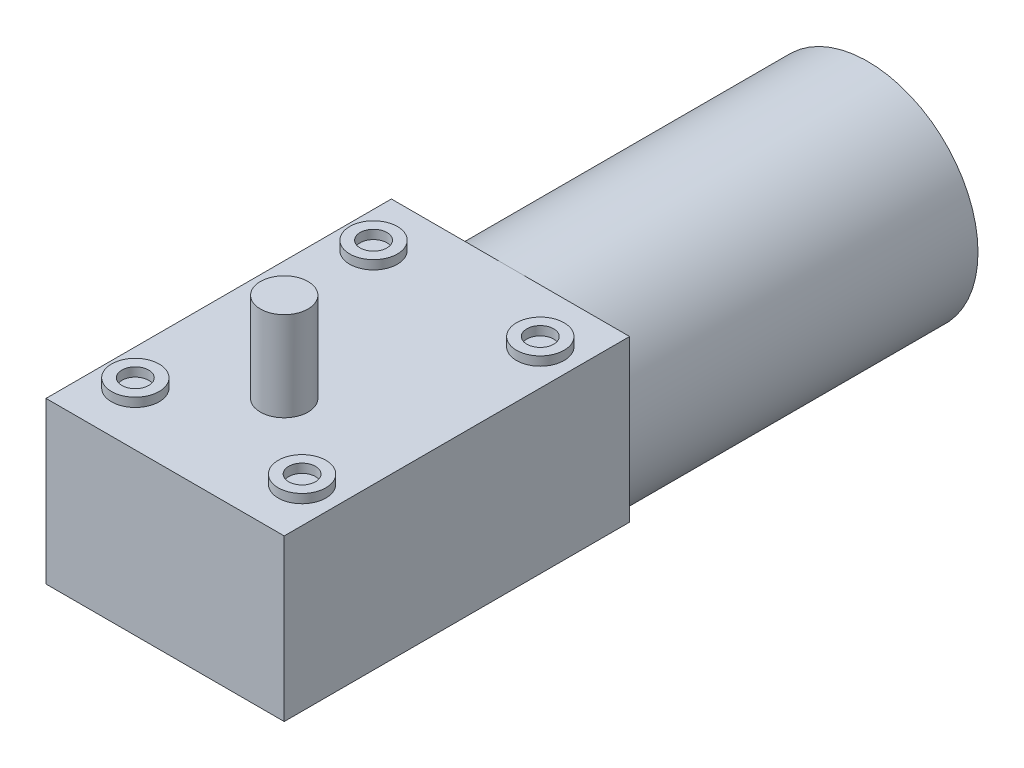
ISO-10303-21;
HEADER;
FILE_DESCRIPTION(('STEP AP214'),'2;1');
FILE_NAME('part.step','',(''),(''),'','','');
FILE_SCHEMA(('AUTOMOTIVE_DESIGN { 1 0 10303 214 1 1 1 1 }'));
ENDSEC;
DATA;
#1=APPLICATION_CONTEXT('core data for automotive mechanical design processes');
#2=APPLICATION_PROTOCOL_DEFINITION('international standard','automotive_design',2000,#1);
#3=PRODUCT_CONTEXT('',#1,'mechanical');
#4=PRODUCT('Part','Part','',(#3));
#5=PRODUCT_RELATED_PRODUCT_CATEGORY('part','',(#4));
#6=PRODUCT_DEFINITION_FORMATION('','',#4);
#7=PRODUCT_DEFINITION_CONTEXT('part definition',#1,'design');
#8=PRODUCT_DEFINITION('design','',#6,#7);
#9=PRODUCT_DEFINITION_SHAPE('','',#8);
#10=(LENGTH_UNIT() NAMED_UNIT(*) SI_UNIT(.MILLI.,.METRE.));
#11=(NAMED_UNIT(*) PLANE_ANGLE_UNIT() SI_UNIT($,.RADIAN.));
#12=(NAMED_UNIT(*) SI_UNIT($,.STERADIAN.) SOLID_ANGLE_UNIT());
#13=UNCERTAINTY_MEASURE_WITH_UNIT(LENGTH_MEASURE(1.E-05),#10,'distance_accuracy_value','');
#14=(GEOMETRIC_REPRESENTATION_CONTEXT(3) GLOBAL_UNCERTAINTY_ASSIGNED_CONTEXT((#13)) GLOBAL_UNIT_ASSIGNED_CONTEXT((#10,
#11,#12)) REPRESENTATION_CONTEXT('',''));
#15=CARTESIAN_POINT('',(0.,0.,0.));
#16=DIRECTION('',(0.,0.,1.));
#17=DIRECTION('',(1.,0.,0.));
#18=AXIS2_PLACEMENT_3D('',#15,#16,#17);
#19=CARTESIAN_POINT('',(0.,0.,60.));
#20=DIRECTION('',(0.,0.,-1.));
#21=DIRECTION('',(-1.,0.,0.));
#22=AXIS2_PLACEMENT_3D('',#19,#20,#21);
#23=CYLINDRICAL_SURFACE('',#22,18.5);
#24=CARTESIAN_POINT('',(0.,0.,60.));
#25=DIRECTION('',(0.,0.,1.));
#26=DIRECTION('',(1.,0.,0.));
#27=AXIS2_PLACEMENT_3D('',#24,#25,#26);
#28=CIRCLE('',#27,18.5);
#29=CARTESIAN_POINT('',(0.,18.5,60.));
#30=VERTEX_POINT('',#29);
#31=CARTESIAN_POINT('',(-16.431676725155,-8.5,60.));
#32=VERTEX_POINT('',#31);
#33=EDGE_CURVE('E109',#30,#32,#28,.T.);
#34=ORIENTED_EDGE('',*,*,#33,.F.);
#35=CARTESIAN_POINT('',(16.431676725155,-8.5,60.));
#36=VERTEX_POINT('',#35);
#37=EDGE_CURVE('E63',#36,#30,#28,.T.);
#38=ORIENTED_EDGE('',*,*,#37,.F.);
#39=EDGE_CURVE('E135',#32,#36,#28,.T.);
#40=ORIENTED_EDGE('',*,*,#39,.F.);
#41=EDGE_LOOP('',(#34,#38,#40));
#42=FACE_BOUND('',#41,.T.);
#43=CARTESIAN_POINT('',(0.,0.,0.));
#44=DIRECTION('',(0.,0.,1.));
#45=DIRECTION('',(1.,0.,0.));
#46=AXIS2_PLACEMENT_3D('',#43,#44,#45);
#47=CIRCLE('',#46,18.5);
#48=CARTESIAN_POINT('',(18.5,0.,0.));
#49=VERTEX_POINT('',#48);
#50=EDGE_CURVE('E132',#49,#49,#47,.T.);
#51=ORIENTED_EDGE('',*,*,#50,.T.);
#52=EDGE_LOOP('',(#51));
#53=FACE_BOUND('',#52,.T.);
#54=ADVANCED_FACE('F41',(#42,#53),#23,.T.);
#55=CARTESIAN_POINT('',(0.,0.,0.));
#56=DIRECTION('',(0.,0.,1.));
#57=DIRECTION('',(1.,0.,0.));
#58=AXIS2_PLACEMENT_3D('',#55,#56,#57);
#59=PLANE('',#58);
#60=ORIENTED_EDGE('',*,*,#50,.F.);
#61=EDGE_LOOP('',(#60));
#62=FACE_BOUND('',#61,.T.);
#63=ADVANCED_FACE('F234',(#62),#59,.F.);
#64=CARTESIAN_POINT('',(0.,0.,60.));
#65=DIRECTION('',(0.,0.,1.));
#66=DIRECTION('',(1.,0.,0.));
#67=AXIS2_PLACEMENT_3D('',#64,#65,#66);
#68=PLANE('',#67);
#69=ORIENTED_EDGE('',*,*,#33,.T.);
#70=DIRECTION('',(1.,0.,0.));
#71=VECTOR('',#70,1.);
#72=CARTESIAN_POINT('',(20.,-8.5,60.));
#73=LINE('',#72,#71);
#74=CARTESIAN_POINT('',(-20.,-8.5,60.));
#75=VERTEX_POINT('',#74);
#76=EDGE_CURVE('E95',#75,#32,#73,.T.);
#77=ORIENTED_EDGE('',*,*,#76,.F.);
#78=DIRECTION('',(0.,-1.,0.));
#79=VECTOR('',#78,1.);
#80=CARTESIAN_POINT('',(-20.,18.5,60.));
#81=LINE('',#80,#79);
#82=CARTESIAN_POINT('',(-20.,18.5,60.));
#83=VERTEX_POINT('',#82);
#84=EDGE_CURVE('E108',#83,#75,#81,.T.);
#85=ORIENTED_EDGE('',*,*,#84,.F.);
#86=DIRECTION('',(-1.,0.,0.));
#87=VECTOR('',#86,1.);
#88=CARTESIAN_POINT('',(-20.,18.5,60.));
#89=LINE('',#88,#87);
#90=EDGE_CURVE('E123',#30,#83,#89,.T.);
#91=ORIENTED_EDGE('',*,*,#90,.F.);
#92=EDGE_LOOP('',(#69,#77,#85,#91));
#93=FACE_BOUND('',#92,.T.);
#94=ADVANCED_FACE('F106',(#93),#68,.F.);
#95=DIRECTION('',(0.,1.,0.));
#96=VECTOR('',#95,1.);
#97=CARTESIAN_POINT('',(20.,18.5,60.));
#98=LINE('',#97,#96);
#99=CARTESIAN_POINT('',(20.,-8.5,60.));
#100=VERTEX_POINT('',#99);
#101=CARTESIAN_POINT('',(20.,18.5,60.));
#102=VERTEX_POINT('',#101);
#103=EDGE_CURVE('E169',#100,#102,#98,.T.);
#104=ORIENTED_EDGE('',*,*,#103,.F.);
#105=EDGE_CURVE('E102',#36,#100,#73,.T.);
#106=ORIENTED_EDGE('',*,*,#105,.F.);
#107=ORIENTED_EDGE('',*,*,#37,.T.);
#108=EDGE_CURVE('E118',#102,#30,#89,.T.);
#109=ORIENTED_EDGE('',*,*,#108,.F.);
#110=EDGE_LOOP('',(#104,#106,#107,#109));
#111=FACE_BOUND('',#110,.T.);
#112=ADVANCED_FACE('F168',(#111),#68,.F.);
#113=CARTESIAN_POINT('',(20.,18.5,118.));
#114=DIRECTION('',(-1.,0.,0.));
#115=DIRECTION('',(0.,0.,1.));
#116=AXIS2_PLACEMENT_3D('',#113,#114,#115);
#117=PLANE('',#116);
#118=DIRECTION('',(0.,1.,0.));
#119=VECTOR('',#118,1.);
#120=CARTESIAN_POINT('',(20.,18.5,118.));
#121=LINE('',#120,#119);
#122=CARTESIAN_POINT('',(20.,-8.5,118.));
#123=VERTEX_POINT('',#122);
#124=CARTESIAN_POINT('',(20.,18.5,118.));
#125=VERTEX_POINT('',#124);
#126=EDGE_CURVE('E117',#123,#125,#121,.T.);
#127=ORIENTED_EDGE('',*,*,#126,.F.);
#128=DIRECTION('',(0.,0.,1.));
#129=VECTOR('',#128,1.);
#130=CARTESIAN_POINT('',(20.,-8.5,18.7689437438234));
#131=LINE('',#130,#129);
#132=EDGE_CURVE('E55',#100,#123,#131,.T.);
#133=ORIENTED_EDGE('',*,*,#132,.F.);
#134=ORIENTED_EDGE('',*,*,#103,.T.);
#135=DIRECTION('',(0.,0.,-1.));
#136=VECTOR('',#135,1.);
#137=CARTESIAN_POINT('',(20.,18.5,118.));
#138=LINE('',#137,#136);
#139=EDGE_CURVE('E128',#125,#102,#138,.T.);
#140=ORIENTED_EDGE('',*,*,#139,.F.);
#141=EDGE_LOOP('',(#127,#133,#134,#140));
#142=FACE_BOUND('',#141,.T.);
#143=ADVANCED_FACE('F154',(#142),#117,.F.);
#144=CARTESIAN_POINT('',(-20.,18.5,118.));
#145=DIRECTION('',(0.,-1.,0.));
#146=DIRECTION('',(0.,0.,-1.));
#147=AXIS2_PLACEMENT_3D('',#144,#145,#146);
#148=PLANE('',#147);
#149=CARTESIAN_POINT('',(-14.,18.5,69.));
#150=DIRECTION('',(0.,-1.,0.));
#151=DIRECTION('',(0.,0.,-1.));
#152=AXIS2_PLACEMENT_3D('',#149,#150,#151);
#153=CIRCLE('',#152,4.);
#154=CARTESIAN_POINT('',(-14.,18.5,65.));
#155=VERTEX_POINT('',#154);
#156=EDGE_CURVE('E11',#155,#155,#153,.F.);
#157=ORIENTED_EDGE('',*,*,#156,.F.);
#158=EDGE_LOOP('',(#157));
#159=FACE_BOUND('',#158,.T.);
#160=CARTESIAN_POINT('',(-14.,18.5,109.));
#161=DIRECTION('',(0.,-1.,0.));
#162=DIRECTION('',(0.,0.,-1.));
#163=AXIS2_PLACEMENT_3D('',#160,#161,#162);
#164=CIRCLE('',#163,4.);
#165=CARTESIAN_POINT('',(-14.,18.5,105.));
#166=VERTEX_POINT('',#165);
#167=EDGE_CURVE('E48',#166,#166,#164,.F.);
#168=ORIENTED_EDGE('',*,*,#167,.F.);
#169=EDGE_LOOP('',(#168));
#170=FACE_BOUND('',#169,.T.);
#171=CARTESIAN_POINT('',(14.,18.5,109.));
#172=DIRECTION('',(0.,-1.,0.));
#173=DIRECTION('',(0.,0.,-1.));
#174=AXIS2_PLACEMENT_3D('',#171,#172,#173);
#175=CIRCLE('',#174,4.);
#176=CARTESIAN_POINT('',(14.,18.5,105.));
#177=VERTEX_POINT('',#176);
#178=EDGE_CURVE('E144',#177,#177,#175,.F.);
#179=ORIENTED_EDGE('',*,*,#178,.F.);
#180=EDGE_LOOP('',(#179));
#181=FACE_BOUND('',#180,.T.);
#182=CARTESIAN_POINT('',(14.,18.5,69.));
#183=DIRECTION('',(0.,-1.,0.));
#184=DIRECTION('',(0.,0.,-1.));
#185=AXIS2_PLACEMENT_3D('',#182,#183,#184);
#186=CIRCLE('',#185,4.);
#187=CARTESIAN_POINT('',(14.,18.5,65.));
#188=VERTEX_POINT('',#187);
#189=EDGE_CURVE('E141',#188,#188,#186,.F.);
#190=ORIENTED_EDGE('',*,*,#189,.F.);
#191=EDGE_LOOP('',(#190));
#192=FACE_BOUND('',#191,.T.);
#193=CARTESIAN_POINT('',(0.,18.5,98.));
#194=DIRECTION('',(0.,-1.,0.));
#195=DIRECTION('',(0.,0.,-1.));
#196=AXIS2_PLACEMENT_3D('',#193,#194,#195);
#197=CIRCLE('',#196,4.);
#198=CARTESIAN_POINT('',(0.,18.5,94.));
#199=VERTEX_POINT('',#198);
#200=EDGE_CURVE('E134',#199,#199,#197,.F.);
#201=ORIENTED_EDGE('',*,*,#200,.F.);
#202=EDGE_LOOP('',(#201));
#203=FACE_BOUND('',#202,.T.);
#204=ORIENTED_EDGE('',*,*,#108,.T.);
#205=ORIENTED_EDGE('',*,*,#90,.T.);
#206=DIRECTION('',(0.,0.,-1.));
#207=VECTOR('',#206,1.);
#208=CARTESIAN_POINT('',(-20.,18.5,118.));
#209=LINE('',#208,#207);
#210=CARTESIAN_POINT('',(-20.,18.5,118.));
#211=VERTEX_POINT('',#210);
#212=EDGE_CURVE('E116',#211,#83,#209,.T.);
#213=ORIENTED_EDGE('',*,*,#212,.F.);
#214=DIRECTION('',(-1.,0.,0.));
#215=VECTOR('',#214,1.);
#216=CARTESIAN_POINT('',(-20.,18.5,118.));
#217=LINE('',#216,#215);
#218=EDGE_CURVE('E120',#125,#211,#217,.T.);
#219=ORIENTED_EDGE('',*,*,#218,.F.);
#220=ORIENTED_EDGE('',*,*,#139,.T.);
#221=EDGE_LOOP('',(#204,#205,#213,#219,#220));
#222=FACE_BOUND('',#221,.T.);
#223=ADVANCED_FACE('F151',(#159,#170,#181,#192,#203,#222),#148,.F.);
#224=CARTESIAN_POINT('',(-20.,18.5,118.));
#225=DIRECTION('',(1.,0.,0.));
#226=DIRECTION('',(0.,1.,0.));
#227=AXIS2_PLACEMENT_3D('',#224,#225,#226);
#228=PLANE('',#227);
#229=ORIENTED_EDGE('',*,*,#84,.T.);
#230=DIRECTION('',(0.,0.,1.));
#231=VECTOR('',#230,1.);
#232=CARTESIAN_POINT('',(-20.,-8.5,18.7689437438234));
#233=LINE('',#232,#231);
#234=CARTESIAN_POINT('',(-20.,-8.5,118.));
#235=VERTEX_POINT('',#234);
#236=EDGE_CURVE('E91',#75,#235,#233,.T.);
#237=ORIENTED_EDGE('',*,*,#236,.T.);
#238=DIRECTION('',(0.,-1.,0.));
#239=VECTOR('',#238,1.);
#240=CARTESIAN_POINT('',(-20.,18.5,118.));
#241=LINE('',#240,#239);
#242=EDGE_CURVE('E129',#211,#235,#241,.T.);
#243=ORIENTED_EDGE('',*,*,#242,.F.);
#244=ORIENTED_EDGE('',*,*,#212,.T.);
#245=EDGE_LOOP('',(#229,#237,#243,#244));
#246=FACE_BOUND('',#245,.T.);
#247=ADVANCED_FACE('F114',(#246),#228,.F.);
#248=CARTESIAN_POINT('',(0.,0.,118.));
#249=DIRECTION('',(0.,0.,1.));
#250=DIRECTION('',(1.,0.,0.));
#251=AXIS2_PLACEMENT_3D('',#248,#249,#250);
#252=PLANE('',#251);
#253=DIRECTION('',(-1.,0.,0.));
#254=VECTOR('',#253,1.);
#255=CARTESIAN_POINT('',(0.,-8.5,118.));
#256=LINE('',#255,#254);
#257=EDGE_CURVE('E97',#123,#235,#256,.T.);
#258=ORIENTED_EDGE('',*,*,#257,.F.);
#259=ORIENTED_EDGE('',*,*,#126,.T.);
#260=ORIENTED_EDGE('',*,*,#218,.T.);
#261=ORIENTED_EDGE('',*,*,#242,.T.);
#262=EDGE_LOOP('',(#258,#259,#260,#261));
#263=FACE_BOUND('',#262,.T.);
#264=ADVANCED_FACE('F247',(#263),#252,.T.);
#265=CARTESIAN_POINT('',(0.,33.5,98.));
#266=DIRECTION('',(0.,-1.,0.));
#267=DIRECTION('',(0.,0.,-1.));
#268=AXIS2_PLACEMENT_3D('',#265,#266,#267);
#269=CYLINDRICAL_SURFACE('',#268,4.);
#270=CARTESIAN_POINT('',(0.,33.5,98.));
#271=DIRECTION('',(0.,1.,0.));
#272=DIRECTION('',(0.,0.,1.));
#273=AXIS2_PLACEMENT_3D('',#270,#271,#272);
#274=CIRCLE('',#273,4.);
#275=CARTESIAN_POINT('',(0.,33.5,102.));
#276=VERTEX_POINT('',#275);
#277=EDGE_CURVE('E110',#276,#276,#274,.T.);
#278=ORIENTED_EDGE('',*,*,#277,.F.);
#279=EDGE_LOOP('',(#278));
#280=FACE_BOUND('',#279,.T.);
#281=ORIENTED_EDGE('',*,*,#200,.T.);
#282=EDGE_LOOP('',(#281));
#283=FACE_BOUND('',#282,.T.);
#284=ADVANCED_FACE('F249',(#280,#283),#269,.T.);
#285=CARTESIAN_POINT('',(0.,33.5,98.));
#286=DIRECTION('',(0.,1.,0.));
#287=DIRECTION('',(0.,0.,1.));
#288=AXIS2_PLACEMENT_3D('',#285,#286,#287);
#289=PLANE('',#288);
#290=ORIENTED_EDGE('',*,*,#277,.T.);
#291=EDGE_LOOP('',(#290));
#292=FACE_BOUND('',#291,.T.);
#293=ADVANCED_FACE('F255',(#292),#289,.T.);
#294=CARTESIAN_POINT('',(0.,0.,60.));
#295=DIRECTION('',(0.,0.,1.));
#296=DIRECTION('',(1.,0.,0.));
#297=AXIS2_PLACEMENT_3D('',#294,#295,#296);
#298=PLANE('',#297);
#299=EDGE_CURVE('E111',#32,#36,#73,.T.);
#300=ORIENTED_EDGE('',*,*,#299,.F.);
#301=ORIENTED_EDGE('',*,*,#39,.T.);
#302=EDGE_LOOP('',(#300,#301));
#303=FACE_BOUND('',#302,.T.);
#304=ADVANCED_FACE('F244',(#303),#298,.T.);
#305=CARTESIAN_POINT('',(20.,-8.5,18.7689437438234));
#306=DIRECTION('',(0.,1.,0.));
#307=DIRECTION('',(-1.,0.,0.));
#308=AXIS2_PLACEMENT_3D('',#305,#306,#307);
#309=PLANE('',#308);
#310=ORIENTED_EDGE('',*,*,#257,.T.);
#311=ORIENTED_EDGE('',*,*,#236,.F.);
#312=ORIENTED_EDGE('',*,*,#76,.T.);
#313=ORIENTED_EDGE('',*,*,#299,.T.);
#314=ORIENTED_EDGE('',*,*,#105,.T.);
#315=ORIENTED_EDGE('',*,*,#132,.T.);
#316=EDGE_LOOP('',(#310,#311,#312,#313,#314,#315));
#317=FACE_BOUND('',#316,.T.);
#318=ADVANCED_FACE('F93',(#317),#309,.F.);
#319=CARTESIAN_POINT('',(14.,20.,69.));
#320=DIRECTION('',(0.,1.,0.));
#321=DIRECTION('',(0.,0.,1.));
#322=AXIS2_PLACEMENT_3D('',#319,#320,#321);
#323=PLANE('',#322);
#324=CARTESIAN_POINT('',(14.,20.,69.));
#325=DIRECTION('',(0.,1.,0.));
#326=DIRECTION('',(0.,0.,1.));
#327=AXIS2_PLACEMENT_3D('',#324,#325,#326);
#328=CIRCLE('',#327,4.);
#329=CARTESIAN_POINT('',(14.,20.,73.));
#330=VERTEX_POINT('',#329);
#331=EDGE_CURVE('E176',#330,#330,#328,.T.);
#332=ORIENTED_EDGE('',*,*,#331,.T.);
#333=EDGE_LOOP('',(#332));
#334=FACE_BOUND('',#333,.T.);
#335=CARTESIAN_POINT('',(14.,20.,69.));
#336=DIRECTION('',(0.,1.,0.));
#337=DIRECTION('',(0.,0.,1.));
#338=AXIS2_PLACEMENT_3D('',#335,#336,#337);
#339=CIRCLE('',#338,2.25);
#340=CARTESIAN_POINT('',(14.,20.,71.25));
#341=VERTEX_POINT('',#340);
#342=EDGE_CURVE('E180',#341,#341,#339,.T.);
#343=ORIENTED_EDGE('',*,*,#342,.F.);
#344=EDGE_LOOP('',(#343));
#345=FACE_BOUND('',#344,.T.);
#346=ADVANCED_FACE('F310',(#334,#345),#323,.T.);
#347=CARTESIAN_POINT('',(14.,20.,69.));
#348=DIRECTION('',(0.,-1.,0.));
#349=DIRECTION('',(0.,0.,-1.));
#350=AXIS2_PLACEMENT_3D('',#347,#348,#349);
#351=CYLINDRICAL_SURFACE('',#350,4.);
#352=ORIENTED_EDGE('',*,*,#331,.F.);
#353=EDGE_LOOP('',(#352));
#354=FACE_BOUND('',#353,.T.);
#355=ORIENTED_EDGE('',*,*,#189,.T.);
#356=EDGE_LOOP('',(#355));
#357=FACE_BOUND('',#356,.T.);
#358=ADVANCED_FACE('F318',(#354,#357),#351,.T.);
#359=CARTESIAN_POINT('',(14.,20.,69.));
#360=DIRECTION('',(0.,-1.,0.));
#361=DIRECTION('',(0.,0.,-1.));
#362=AXIS2_PLACEMENT_3D('',#359,#360,#361);
#363=CYLINDRICAL_SURFACE('',#362,2.25);
#364=ORIENTED_EDGE('',*,*,#342,.T.);
#365=EDGE_LOOP('',(#364));
#366=FACE_BOUND('',#365,.T.);
#367=CARTESIAN_POINT('',(14.,18.5,69.));
#368=DIRECTION('',(0.,1.,0.));
#369=DIRECTION('',(0.,0.,1.));
#370=AXIS2_PLACEMENT_3D('',#367,#368,#369);
#371=CIRCLE('',#370,2.25);
#372=CARTESIAN_POINT('',(14.,18.5,71.25));
#373=VERTEX_POINT('',#372);
#374=EDGE_CURVE('E181',#373,#373,#371,.T.);
#375=ORIENTED_EDGE('',*,*,#374,.F.);
#376=EDGE_LOOP('',(#375));
#377=FACE_BOUND('',#376,.T.);
#378=ADVANCED_FACE('F326',(#366,#377),#363,.F.);
#379=ORIENTED_EDGE('',*,*,#374,.T.);
#380=EDGE_LOOP('',(#379));
#381=FACE_BOUND('',#380,.T.);
#382=ADVANCED_FACE('F158',(#381),#148,.F.);
#383=CARTESIAN_POINT('',(14.,20.,109.));
#384=DIRECTION('',(0.,1.,0.));
#385=DIRECTION('',(0.,0.,1.));
#386=AXIS2_PLACEMENT_3D('',#383,#384,#385);
#387=PLANE('',#386);
#388=CARTESIAN_POINT('',(14.,20.,109.));
#389=DIRECTION('',(0.,1.,0.));
#390=DIRECTION('',(0.,0.,1.));
#391=AXIS2_PLACEMENT_3D('',#388,#389,#390);
#392=CIRCLE('',#391,4.);
#393=CARTESIAN_POINT('',(14.,20.,113.));
#394=VERTEX_POINT('',#393);
#395=EDGE_CURVE('E184',#394,#394,#392,.T.);
#396=ORIENTED_EDGE('',*,*,#395,.T.);
#397=EDGE_LOOP('',(#396));
#398=FACE_BOUND('',#397,.T.);
#399=CARTESIAN_POINT('',(14.,20.,109.));
#400=DIRECTION('',(0.,1.,0.));
#401=DIRECTION('',(0.,0.,1.));
#402=AXIS2_PLACEMENT_3D('',#399,#400,#401);
#403=CIRCLE('',#402,2.25);
#404=CARTESIAN_POINT('',(14.,20.,111.25));
#405=VERTEX_POINT('',#404);
#406=EDGE_CURVE('E189',#405,#405,#403,.T.);
#407=ORIENTED_EDGE('',*,*,#406,.F.);
#408=EDGE_LOOP('',(#407));
#409=FACE_BOUND('',#408,.T.);
#410=ADVANCED_FACE('F341',(#398,#409),#387,.T.);
#411=CARTESIAN_POINT('',(14.,20.,109.));
#412=DIRECTION('',(0.,-1.,0.));
#413=DIRECTION('',(0.,0.,-1.));
#414=AXIS2_PLACEMENT_3D('',#411,#412,#413);
#415=CYLINDRICAL_SURFACE('',#414,4.);
#416=ORIENTED_EDGE('',*,*,#395,.F.);
#417=EDGE_LOOP('',(#416));
#418=FACE_BOUND('',#417,.T.);
#419=ORIENTED_EDGE('',*,*,#178,.T.);
#420=EDGE_LOOP('',(#419));
#421=FACE_BOUND('',#420,.T.);
#422=ADVANCED_FACE('F348',(#418,#421),#415,.T.);
#423=CARTESIAN_POINT('',(14.,20.,109.));
#424=DIRECTION('',(0.,-1.,0.));
#425=DIRECTION('',(0.,0.,-1.));
#426=AXIS2_PLACEMENT_3D('',#423,#424,#425);
#427=CYLINDRICAL_SURFACE('',#426,2.25);
#428=ORIENTED_EDGE('',*,*,#406,.T.);
#429=EDGE_LOOP('',(#428));
#430=FACE_BOUND('',#429,.T.);
#431=CARTESIAN_POINT('',(14.,18.5,109.));
#432=DIRECTION('',(0.,1.,0.));
#433=DIRECTION('',(0.,0.,1.));
#434=AXIS2_PLACEMENT_3D('',#431,#432,#433);
#435=CIRCLE('',#434,2.25);
#436=CARTESIAN_POINT('',(14.,18.5,111.25));
#437=VERTEX_POINT('',#436);
#438=EDGE_CURVE('E190',#437,#437,#435,.T.);
#439=ORIENTED_EDGE('',*,*,#438,.F.);
#440=EDGE_LOOP('',(#439));
#441=FACE_BOUND('',#440,.T.);
#442=ADVANCED_FACE('F356',(#430,#441),#427,.F.);
#443=ORIENTED_EDGE('',*,*,#438,.T.);
#444=EDGE_LOOP('',(#443));
#445=FACE_BOUND('',#444,.T.);
#446=ADVANCED_FACE('F231',(#445),#148,.F.);
#447=CARTESIAN_POINT('',(-14.,20.,109.));
#448=DIRECTION('',(0.,-1.,0.));
#449=DIRECTION('',(0.,0.,-1.));
#450=AXIS2_PLACEMENT_3D('',#447,#448,#449);
#451=PLANE('',#450);
#452=CARTESIAN_POINT('',(-14.,20.,109.));
#453=DIRECTION('',(0.,1.,0.));
#454=DIRECTION('',(0.,0.,-1.));
#455=AXIS2_PLACEMENT_3D('',#452,#453,#454);
#456=CIRCLE('',#455,4.);
#457=CARTESIAN_POINT('',(-14.,20.,105.));
#458=VERTEX_POINT('',#457);
#459=EDGE_CURVE('E193',#458,#458,#456,.T.);
#460=ORIENTED_EDGE('',*,*,#459,.T.);
#461=EDGE_LOOP('',(#460));
#462=FACE_BOUND('',#461,.T.);
#463=CARTESIAN_POINT('',(-14.,20.,109.));
#464=DIRECTION('',(0.,1.,0.));
#465=DIRECTION('',(0.,0.,-1.));
#466=AXIS2_PLACEMENT_3D('',#463,#464,#465);
#467=CIRCLE('',#466,2.25);
#468=CARTESIAN_POINT('',(-14.,20.,106.75));
#469=VERTEX_POINT('',#468);
#470=EDGE_CURVE('E198',#469,#469,#467,.T.);
#471=ORIENTED_EDGE('',*,*,#470,.F.);
#472=EDGE_LOOP('',(#471));
#473=FACE_BOUND('',#472,.T.);
#474=ADVANCED_FACE('F371',(#462,#473),#451,.F.);
#475=CARTESIAN_POINT('',(-14.,20.,109.));
#476=DIRECTION('',(0.,-1.,0.));
#477=DIRECTION('',(0.,0.,-1.));
#478=AXIS2_PLACEMENT_3D('',#475,#476,#477);
#479=CYLINDRICAL_SURFACE('',#478,4.);
#480=ORIENTED_EDGE('',*,*,#459,.F.);
#481=EDGE_LOOP('',(#480));
#482=FACE_BOUND('',#481,.T.);
#483=ORIENTED_EDGE('',*,*,#167,.T.);
#484=EDGE_LOOP('',(#483));
#485=FACE_BOUND('',#484,.T.);
#486=ADVANCED_FACE('F149',(#482,#485),#479,.T.);
#487=CARTESIAN_POINT('',(-14.,20.,109.));
#488=DIRECTION('',(0.,-1.,0.));
#489=DIRECTION('',(0.,0.,-1.));
#490=AXIS2_PLACEMENT_3D('',#487,#488,#489);
#491=CYLINDRICAL_SURFACE('',#490,2.25);
#492=ORIENTED_EDGE('',*,*,#470,.T.);
#493=EDGE_LOOP('',(#492));
#494=FACE_BOUND('',#493,.T.);
#495=CARTESIAN_POINT('',(-14.,18.5,109.));
#496=DIRECTION('',(0.,1.,0.));
#497=DIRECTION('',(0.,0.,-1.));
#498=AXIS2_PLACEMENT_3D('',#495,#496,#497);
#499=CIRCLE('',#498,2.25);
#500=CARTESIAN_POINT('',(-14.,18.5,106.75));
#501=VERTEX_POINT('',#500);
#502=EDGE_CURVE('E199',#501,#501,#499,.T.);
#503=ORIENTED_EDGE('',*,*,#502,.F.);
#504=EDGE_LOOP('',(#503));
#505=FACE_BOUND('',#504,.T.);
#506=ADVANCED_FACE('F229',(#494,#505),#491,.F.);
#507=ORIENTED_EDGE('',*,*,#502,.T.);
#508=EDGE_LOOP('',(#507));
#509=FACE_BOUND('',#508,.T.);
#510=ADVANCED_FACE('F220',(#509),#148,.F.);
#511=CARTESIAN_POINT('',(-14.,20.,69.));
#512=DIRECTION('',(0.,-1.,0.));
#513=DIRECTION('',(0.,0.,-1.));
#514=AXIS2_PLACEMENT_3D('',#511,#512,#513);
#515=PLANE('',#514);
#516=CARTESIAN_POINT('',(-14.,20.,69.));
#517=DIRECTION('',(0.,1.,0.));
#518=DIRECTION('',(0.,0.,-1.));
#519=AXIS2_PLACEMENT_3D('',#516,#517,#518);
#520=CIRCLE('',#519,4.);
#521=CARTESIAN_POINT('',(-14.,20.,65.));
#522=VERTEX_POINT('',#521);
#523=EDGE_CURVE('E202',#522,#522,#520,.T.);
#524=ORIENTED_EDGE('',*,*,#523,.T.);
#525=EDGE_LOOP('',(#524));
#526=FACE_BOUND('',#525,.T.);
#527=CARTESIAN_POINT('',(-14.,20.,69.));
#528=DIRECTION('',(0.,1.,0.));
#529=DIRECTION('',(0.,0.,-1.));
#530=AXIS2_PLACEMENT_3D('',#527,#528,#529);
#531=CIRCLE('',#530,2.25);
#532=CARTESIAN_POINT('',(-14.,20.,66.75));
#533=VERTEX_POINT('',#532);
#534=EDGE_CURVE('E207',#533,#533,#531,.T.);
#535=ORIENTED_EDGE('',*,*,#534,.F.);
#536=EDGE_LOOP('',(#535));
#537=FACE_BOUND('',#536,.T.);
#538=ADVANCED_FACE('F217',(#526,#537),#515,.F.);
#539=CARTESIAN_POINT('',(-14.,20.,69.));
#540=DIRECTION('',(0.,-1.,0.));
#541=DIRECTION('',(0.,0.,-1.));
#542=AXIS2_PLACEMENT_3D('',#539,#540,#541);
#543=CYLINDRICAL_SURFACE('',#542,4.);
#544=ORIENTED_EDGE('',*,*,#523,.F.);
#545=EDGE_LOOP('',(#544));
#546=FACE_BOUND('',#545,.T.);
#547=ORIENTED_EDGE('',*,*,#156,.T.);
#548=EDGE_LOOP('',(#547));
#549=FACE_BOUND('',#548,.T.);
#550=ADVANCED_FACE('F219',(#546,#549),#543,.T.);
#551=CARTESIAN_POINT('',(-14.,20.,69.));
#552=DIRECTION('',(0.,-1.,0.));
#553=DIRECTION('',(0.,0.,-1.));
#554=AXIS2_PLACEMENT_3D('',#551,#552,#553);
#555=CYLINDRICAL_SURFACE('',#554,2.25);
#556=ORIENTED_EDGE('',*,*,#534,.T.);
#557=EDGE_LOOP('',(#556));
#558=FACE_BOUND('',#557,.T.);
#559=CARTESIAN_POINT('',(-14.,18.5,69.));
#560=DIRECTION('',(0.,1.,0.));
#561=DIRECTION('',(0.,0.,-1.));
#562=AXIS2_PLACEMENT_3D('',#559,#560,#561);
#563=CIRCLE('',#562,2.25);
#564=CARTESIAN_POINT('',(-14.,18.5,66.75));
#565=VERTEX_POINT('',#564);
#566=EDGE_CURVE('E208',#565,#565,#563,.T.);
#567=ORIENTED_EDGE('',*,*,#566,.F.);
#568=EDGE_LOOP('',(#567));
#569=FACE_BOUND('',#568,.T.);
#570=ADVANCED_FACE('F214',(#558,#569),#555,.F.);
#571=ORIENTED_EDGE('',*,*,#566,.T.);
#572=EDGE_LOOP('',(#571));
#573=FACE_BOUND('',#572,.T.);
#574=ADVANCED_FACE('F157',(#573),#148,.F.);
#575=CLOSED_SHELL('',(#54,#63,#94,#112,#143,#223,#247,#264,#284,#293,#304,#318,#346,#358,#378,
#382,#410,#422,#442,#446,#474,#486,#506,#510,#538,#550,#570,#574));
#576=MANIFOLD_SOLID_BREP('B2',#575);
#577=ADVANCED_BREP_SHAPE_REPRESENTATION('',(#18,#576),#14);
#578=SHAPE_DEFINITION_REPRESENTATION(#9,#577);
ENDSEC;
END-ISO-10303-21;
